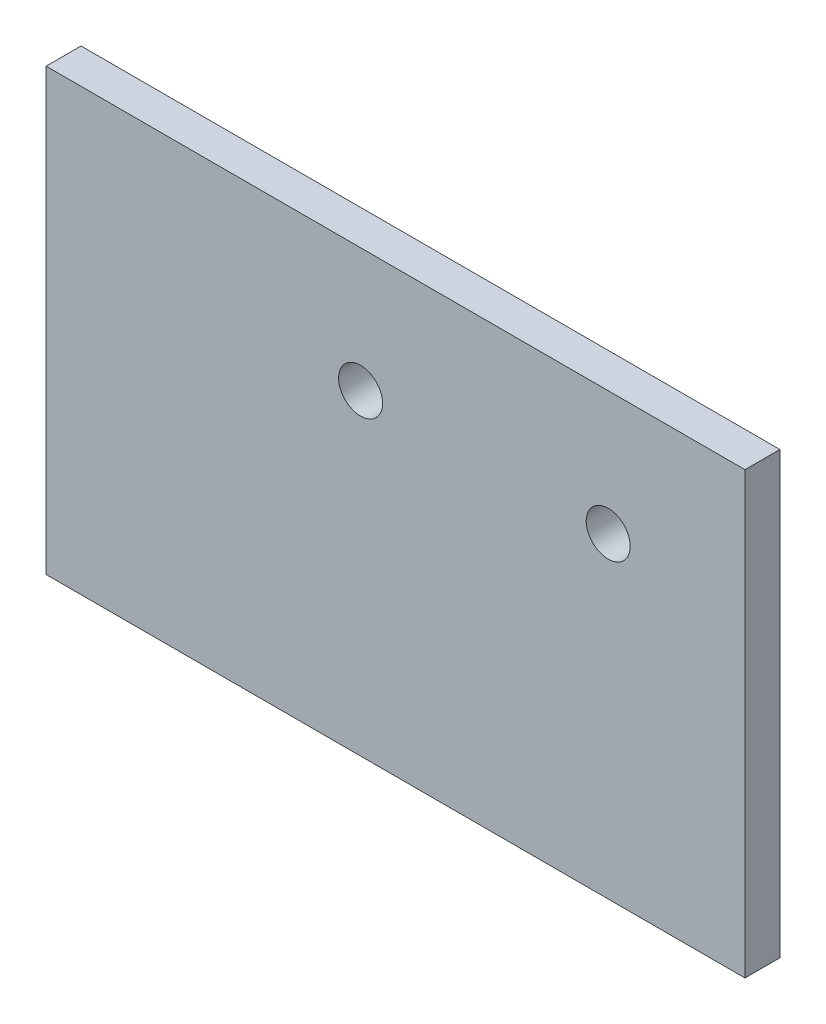
ISO-10303-21;
HEADER;
FILE_DESCRIPTION(('STEP AP214'),'2;1');
FILE_NAME('part.step','',(''),(''),'','','');
FILE_SCHEMA(('AUTOMOTIVE_DESIGN { 1 0 10303 214 1 1 1 1 }'));
ENDSEC;
DATA;
#1=APPLICATION_CONTEXT('core data for automotive mechanical design processes');
#2=APPLICATION_PROTOCOL_DEFINITION('international standard','automotive_design',2000,#1);
#3=PRODUCT_CONTEXT('',#1,'mechanical');
#4=PRODUCT('Part','Part','',(#3));
#5=PRODUCT_RELATED_PRODUCT_CATEGORY('part','',(#4));
#6=PRODUCT_DEFINITION_FORMATION('','',#4);
#7=PRODUCT_DEFINITION_CONTEXT('part definition',#1,'design');
#8=PRODUCT_DEFINITION('design','',#6,#7);
#9=PRODUCT_DEFINITION_SHAPE('','',#8);
#10=(LENGTH_UNIT() NAMED_UNIT(*) SI_UNIT(.MILLI.,.METRE.));
#11=(NAMED_UNIT(*) PLANE_ANGLE_UNIT() SI_UNIT($,.RADIAN.));
#12=(NAMED_UNIT(*) SI_UNIT($,.STERADIAN.) SOLID_ANGLE_UNIT());
#13=UNCERTAINTY_MEASURE_WITH_UNIT(LENGTH_MEASURE(1.E-05),#10,'distance_accuracy_value','');
#14=(GEOMETRIC_REPRESENTATION_CONTEXT(3) GLOBAL_UNCERTAINTY_ASSIGNED_CONTEXT((#13)) GLOBAL_UNIT_ASSIGNED_CONTEXT((#10,
#11,#12)) REPRESENTATION_CONTEXT('',''));
#15=CARTESIAN_POINT('',(0.,0.,0.));
#16=DIRECTION('',(0.,0.,1.));
#17=DIRECTION('',(1.,0.,0.));
#18=AXIS2_PLACEMENT_3D('',#15,#16,#17);
#19=CARTESIAN_POINT('',(0.,0.,6.35));
#20=DIRECTION('',(0.,0.,1.));
#21=DIRECTION('',(1.,0.,0.));
#22=AXIS2_PLACEMENT_3D('',#19,#20,#21);
#23=PLANE('',#22);
#24=CARTESIAN_POINT('',(102.15,-22.5,6.35));
#25=DIRECTION('',(0.,0.,1.));
#26=DIRECTION('',(1.,0.,0.));
#27=AXIS2_PLACEMENT_3D('',#24,#25,#26);
#28=CIRCLE('',#27,4.00000000000001);
#29=CARTESIAN_POINT('',(106.15,-22.5,6.35));
#30=VERTEX_POINT('',#29);
#31=EDGE_CURVE('E112',#30,#30,#28,.T.);
#32=ORIENTED_EDGE('',*,*,#31,.F.);
#33=EDGE_LOOP('',(#32));
#34=FACE_BOUND('',#33,.T.);
#35=DIRECTION('',(0.,-1.,0.));
#36=VECTOR('',#35,1.);
#37=CARTESIAN_POINT('',(0.,0.,6.35));
#38=LINE('',#37,#36);
#39=CARTESIAN_POINT('',(0.,0.,6.35));
#40=VERTEX_POINT('',#39);
#41=CARTESIAN_POINT('',(0.,-80.,6.35));
#42=VERTEX_POINT('',#41);
#43=EDGE_CURVE('E92',#40,#42,#38,.T.);
#44=ORIENTED_EDGE('',*,*,#43,.T.);
#45=DIRECTION('',(1.,0.,0.));
#46=VECTOR('',#45,1.);
#47=CARTESIAN_POINT('',(0.,-80.,6.35));
#48=LINE('',#47,#46);
#49=CARTESIAN_POINT('',(127.,-80.,6.35));
#50=VERTEX_POINT('',#49);
#51=EDGE_CURVE('E87',#42,#50,#48,.T.);
#52=ORIENTED_EDGE('',*,*,#51,.T.);
#53=DIRECTION('',(0.,1.,0.));
#54=VECTOR('',#53,1.);
#55=CARTESIAN_POINT('',(127.,0.,6.35));
#56=LINE('',#55,#54);
#57=CARTESIAN_POINT('',(127.,0.,6.35));
#58=VERTEX_POINT('',#57);
#59=EDGE_CURVE('E90',#50,#58,#56,.T.);
#60=ORIENTED_EDGE('',*,*,#59,.T.);
#61=DIRECTION('',(-1.,0.,0.));
#62=VECTOR('',#61,1.);
#63=CARTESIAN_POINT('',(0.,0.,6.35));
#64=LINE('',#63,#62);
#65=EDGE_CURVE('E57',#58,#40,#64,.T.);
#66=ORIENTED_EDGE('',*,*,#65,.T.);
#67=EDGE_LOOP('',(#44,#52,#60,#66));
#68=FACE_BOUND('',#67,.T.);
#69=CARTESIAN_POINT('',(57.15,-22.5,6.35));
#70=DIRECTION('',(0.,0.,1.));
#71=DIRECTION('',(1.,0.,0.));
#72=AXIS2_PLACEMENT_3D('',#69,#70,#71);
#73=CIRCLE('',#72,4.00000470000002);
#74=CARTESIAN_POINT('',(61.1500047,-22.5,6.35));
#75=VERTEX_POINT('',#74);
#76=EDGE_CURVE('E134',#75,#75,#73,.T.);
#77=ORIENTED_EDGE('',*,*,#76,.F.);
#78=EDGE_LOOP('',(#77));
#79=FACE_BOUND('',#78,.T.);
#80=ADVANCED_FACE('F39',(#34,#68,#79),#23,.T.);
#81=CARTESIAN_POINT('',(0.,0.,0.));
#82=DIRECTION('',(0.,0.,1.));
#83=DIRECTION('',(1.,0.,0.));
#84=AXIS2_PLACEMENT_3D('',#81,#82,#83);
#85=PLANE('',#84);
#86=DIRECTION('',(0.,-1.,0.));
#87=VECTOR('',#86,1.);
#88=CARTESIAN_POINT('',(0.,0.,0.));
#89=LINE('',#88,#87);
#90=CARTESIAN_POINT('',(0.,0.,0.));
#91=VERTEX_POINT('',#90);
#92=CARTESIAN_POINT('',(0.,-80.,0.));
#93=VERTEX_POINT('',#92);
#94=EDGE_CURVE('E108',#91,#93,#89,.T.);
#95=ORIENTED_EDGE('',*,*,#94,.F.);
#96=DIRECTION('',(-1.,0.,0.));
#97=VECTOR('',#96,1.);
#98=CARTESIAN_POINT('',(0.,0.,0.));
#99=LINE('',#98,#97);
#100=CARTESIAN_POINT('',(127.,0.,0.));
#101=VERTEX_POINT('',#100);
#102=EDGE_CURVE('E80',#101,#91,#99,.T.);
#103=ORIENTED_EDGE('',*,*,#102,.F.);
#104=DIRECTION('',(0.,1.,0.));
#105=VECTOR('',#104,1.);
#106=CARTESIAN_POINT('',(127.,0.,0.));
#107=LINE('',#106,#105);
#108=CARTESIAN_POINT('',(127.,-80.,0.));
#109=VERTEX_POINT('',#108);
#110=EDGE_CURVE('E74',#109,#101,#107,.T.);
#111=ORIENTED_EDGE('',*,*,#110,.F.);
#112=DIRECTION('',(1.,0.,0.));
#113=VECTOR('',#112,1.);
#114=CARTESIAN_POINT('',(0.,-80.,0.));
#115=LINE('',#114,#113);
#116=EDGE_CURVE('E97',#93,#109,#115,.T.);
#117=ORIENTED_EDGE('',*,*,#116,.F.);
#118=EDGE_LOOP('',(#95,#103,#111,#117));
#119=FACE_BOUND('',#118,.T.);
#120=CARTESIAN_POINT('',(102.15,-22.5,0.));
#121=DIRECTION('',(0.,0.,1.));
#122=DIRECTION('',(1.,0.,0.));
#123=AXIS2_PLACEMENT_3D('',#120,#121,#122);
#124=CIRCLE('',#123,4.00000000000001);
#125=CARTESIAN_POINT('',(106.15,-22.5,0.));
#126=VERTEX_POINT('',#125);
#127=EDGE_CURVE('E130',#126,#126,#124,.T.);
#128=ORIENTED_EDGE('',*,*,#127,.T.);
#129=EDGE_LOOP('',(#128));
#130=FACE_BOUND('',#129,.T.);
#131=CARTESIAN_POINT('',(57.15,-22.5,0.));
#132=DIRECTION('',(0.,0.,1.));
#133=DIRECTION('',(1.,0.,0.));
#134=AXIS2_PLACEMENT_3D('',#131,#132,#133);
#135=CIRCLE('',#134,4.00000470000002);
#136=CARTESIAN_POINT('',(61.1500047,-22.5,0.));
#137=VERTEX_POINT('',#136);
#138=EDGE_CURVE('E138',#137,#137,#135,.T.);
#139=ORIENTED_EDGE('',*,*,#138,.T.);
#140=EDGE_LOOP('',(#139));
#141=FACE_BOUND('',#140,.T.);
#142=ADVANCED_FACE('F125',(#119,#130,#141),#85,.F.);
#143=CARTESIAN_POINT('',(0.,0.,6.35));
#144=DIRECTION('',(1.,0.,0.));
#145=DIRECTION('',(0.,0.,-1.));
#146=AXIS2_PLACEMENT_3D('',#143,#144,#145);
#147=PLANE('',#146);
#148=ORIENTED_EDGE('',*,*,#94,.T.);
#149=DIRECTION('',(0.,0.,-1.));
#150=VECTOR('',#149,1.);
#151=CARTESIAN_POINT('',(0.,-80.,6.35));
#152=LINE('',#151,#150);
#153=EDGE_CURVE('E11',#42,#93,#152,.T.);
#154=ORIENTED_EDGE('',*,*,#153,.F.);
#155=ORIENTED_EDGE('',*,*,#43,.F.);
#156=DIRECTION('',(0.,0.,-1.));
#157=VECTOR('',#156,1.);
#158=CARTESIAN_POINT('',(0.,0.,6.35));
#159=LINE('',#158,#157);
#160=EDGE_CURVE('E104',#40,#91,#159,.T.);
#161=ORIENTED_EDGE('',*,*,#160,.T.);
#162=EDGE_LOOP('',(#148,#154,#155,#161));
#163=FACE_BOUND('',#162,.T.);
#164=ADVANCED_FACE('F41',(#163),#147,.F.);
#165=CARTESIAN_POINT('',(0.,-80.,6.35));
#166=DIRECTION('',(0.,1.,0.));
#167=DIRECTION('',(0.,0.,1.));
#168=AXIS2_PLACEMENT_3D('',#165,#166,#167);
#169=PLANE('',#168);
#170=ORIENTED_EDGE('',*,*,#116,.T.);
#171=DIRECTION('',(0.,0.,-1.));
#172=VECTOR('',#171,1.);
#173=CARTESIAN_POINT('',(127.,-80.,6.35));
#174=LINE('',#173,#172);
#175=EDGE_CURVE('E49',#50,#109,#174,.T.);
#176=ORIENTED_EDGE('',*,*,#175,.F.);
#177=ORIENTED_EDGE('',*,*,#51,.F.);
#178=ORIENTED_EDGE('',*,*,#153,.T.);
#179=EDGE_LOOP('',(#170,#176,#177,#178));
#180=FACE_BOUND('',#179,.T.);
#181=ADVANCED_FACE('F96',(#180),#169,.F.);
#182=CARTESIAN_POINT('',(127.,0.,6.35));
#183=DIRECTION('',(-1.,0.,0.));
#184=DIRECTION('',(0.,0.,1.));
#185=AXIS2_PLACEMENT_3D('',#182,#183,#184);
#186=PLANE('',#185);
#187=ORIENTED_EDGE('',*,*,#110,.T.);
#188=DIRECTION('',(0.,0.,-1.));
#189=VECTOR('',#188,1.);
#190=CARTESIAN_POINT('',(127.,0.,6.35));
#191=LINE('',#190,#189);
#192=EDGE_CURVE('E99',#58,#101,#191,.T.);
#193=ORIENTED_EDGE('',*,*,#192,.F.);
#194=ORIENTED_EDGE('',*,*,#59,.F.);
#195=ORIENTED_EDGE('',*,*,#175,.T.);
#196=EDGE_LOOP('',(#187,#193,#194,#195));
#197=FACE_BOUND('',#196,.T.);
#198=ADVANCED_FACE('F100',(#197),#186,.F.);
#199=CARTESIAN_POINT('',(0.,0.,6.35));
#200=DIRECTION('',(0.,-1.,0.));
#201=DIRECTION('',(1.,0.,0.));
#202=AXIS2_PLACEMENT_3D('',#199,#200,#201);
#203=PLANE('',#202);
#204=ORIENTED_EDGE('',*,*,#102,.T.);
#205=ORIENTED_EDGE('',*,*,#160,.F.);
#206=ORIENTED_EDGE('',*,*,#65,.F.);
#207=ORIENTED_EDGE('',*,*,#192,.T.);
#208=EDGE_LOOP('',(#204,#205,#206,#207));
#209=FACE_BOUND('',#208,.T.);
#210=ADVANCED_FACE('F122',(#209),#203,.F.);
#211=CARTESIAN_POINT('',(102.15,-22.5,6.35));
#212=DIRECTION('',(0.,0.,-1.));
#213=DIRECTION('',(-1.,0.,0.));
#214=AXIS2_PLACEMENT_3D('',#211,#212,#213);
#215=CYLINDRICAL_SURFACE('',#214,4.00000000000001);
#216=ORIENTED_EDGE('',*,*,#31,.T.);
#217=EDGE_LOOP('',(#216));
#218=FACE_BOUND('',#217,.T.);
#219=ORIENTED_EDGE('',*,*,#127,.F.);
#220=EDGE_LOOP('',(#219));
#221=FACE_BOUND('',#220,.T.);
#222=ADVANCED_FACE('F157',(#218,#221),#215,.F.);
#223=CARTESIAN_POINT('',(57.15,-22.5,6.35));
#224=DIRECTION('',(0.,0.,-1.));
#225=DIRECTION('',(-1.,0.,0.));
#226=AXIS2_PLACEMENT_3D('',#223,#224,#225);
#227=CYLINDRICAL_SURFACE('',#226,4.00000470000002);
#228=ORIENTED_EDGE('',*,*,#76,.T.);
#229=EDGE_LOOP('',(#228));
#230=FACE_BOUND('',#229,.T.);
#231=ORIENTED_EDGE('',*,*,#138,.F.);
#232=EDGE_LOOP('',(#231));
#233=FACE_BOUND('',#232,.T.);
#234=ADVANCED_FACE('F146',(#230,#233),#227,.F.);
#235=CLOSED_SHELL('',(#80,#142,#164,#181,#198,#210,#222,#234));
#236=MANIFOLD_SOLID_BREP('B2',#235);
#237=ADVANCED_BREP_SHAPE_REPRESENTATION('',(#18,#236),#14);
#238=SHAPE_DEFINITION_REPRESENTATION(#9,#237);
ENDSEC;
END-ISO-10303-21;
